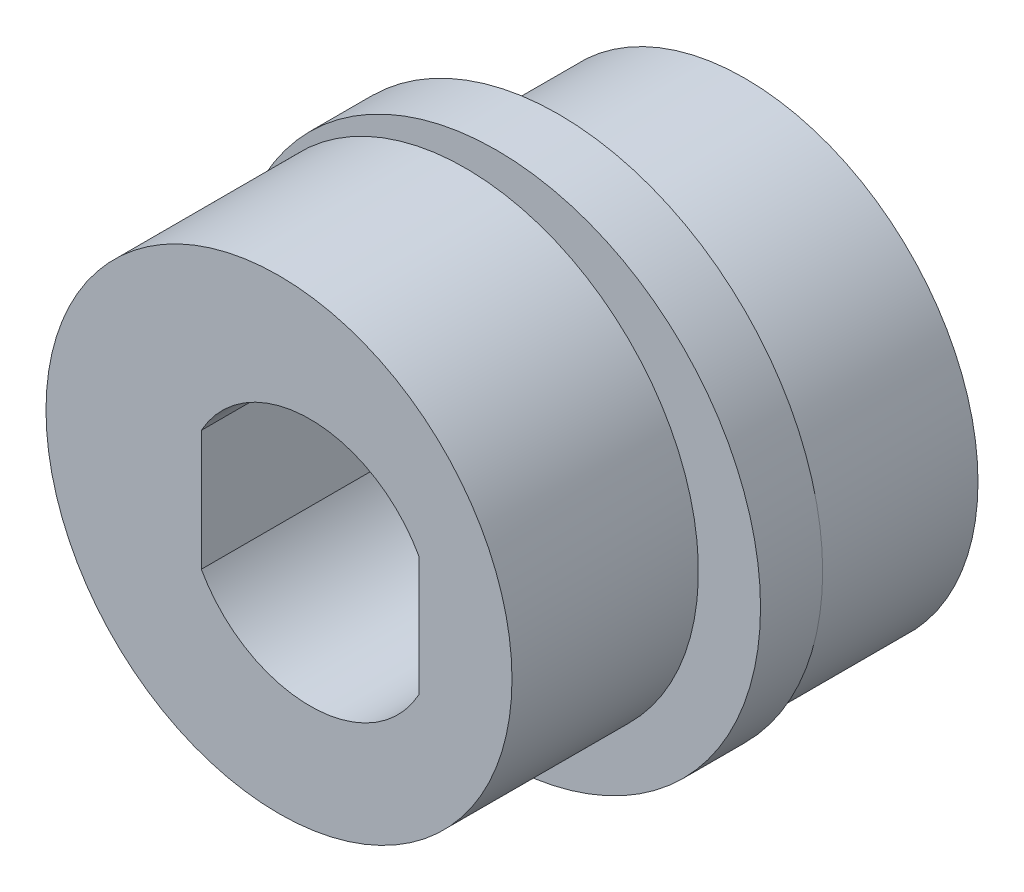
ISO-10303-21;
HEADER;
FILE_DESCRIPTION(('STEP AP214'),'2;1');
FILE_NAME('part.step','',(''),(''),'','','');
FILE_SCHEMA(('AUTOMOTIVE_DESIGN { 1 0 10303 214 1 1 1 1 }'));
ENDSEC;
DATA;
#1=APPLICATION_CONTEXT('core data for automotive mechanical design processes');
#2=APPLICATION_PROTOCOL_DEFINITION('international standard','automotive_design',2000,#1);
#3=PRODUCT_CONTEXT('',#1,'mechanical');
#4=PRODUCT('Part','Part','',(#3));
#5=PRODUCT_RELATED_PRODUCT_CATEGORY('part','',(#4));
#6=PRODUCT_DEFINITION_FORMATION('','',#4);
#7=PRODUCT_DEFINITION_CONTEXT('part definition',#1,'design');
#8=PRODUCT_DEFINITION('design','',#6,#7);
#9=PRODUCT_DEFINITION_SHAPE('','',#8);
#10=(LENGTH_UNIT() NAMED_UNIT(*) SI_UNIT(.MILLI.,.METRE.));
#11=(NAMED_UNIT(*) PLANE_ANGLE_UNIT() SI_UNIT($,.RADIAN.));
#12=(NAMED_UNIT(*) SI_UNIT($,.STERADIAN.) SOLID_ANGLE_UNIT());
#13=UNCERTAINTY_MEASURE_WITH_UNIT(LENGTH_MEASURE(1.E-05),#10,'distance_accuracy_value','');
#14=(GEOMETRIC_REPRESENTATION_CONTEXT(3) GLOBAL_UNCERTAINTY_ASSIGNED_CONTEXT((#13)) GLOBAL_UNIT_ASSIGNED_CONTEXT((#10,
#11,#12)) REPRESENTATION_CONTEXT('',''));
#15=CARTESIAN_POINT('',(0.,0.,0.));
#16=DIRECTION('',(0.,0.,1.));
#17=DIRECTION('',(1.,0.,0.));
#18=AXIS2_PLACEMENT_3D('',#15,#16,#17);
#19=CARTESIAN_POINT('',(-1.,0.,6.));
#20=DIRECTION('',(0.,0.,1.));
#21=DIRECTION('',(1.,0.,0.));
#22=AXIS2_PLACEMENT_3D('',#19,#20,#21);
#23=PLANE('',#22);
#24=CARTESIAN_POINT('',(-1.,0.,6.));
#25=DIRECTION('',(0.,0.,1.));
#26=DIRECTION('',(1.,0.,0.));
#27=AXIS2_PLACEMENT_3D('',#24,#25,#26);
#28=CIRCLE('',#27,7.5);
#29=CARTESIAN_POINT('',(6.5,0.,6.));
#30=VERTEX_POINT('',#29);
#31=EDGE_CURVE('E45',#30,#30,#28,.T.);
#32=ORIENTED_EDGE('',*,*,#31,.T.);
#33=EDGE_LOOP('',(#32));
#34=FACE_BOUND('',#33,.T.);
#35=DIRECTION('',(0.,-1.,0.));
#36=VECTOR('',#35,1.);
#37=CARTESIAN_POINT('',(-3.5,-1.93649167310371,6.));
#38=LINE('',#37,#36);
#39=CARTESIAN_POINT('',(-3.5,1.93649167310371,6.));
#40=VERTEX_POINT('',#39);
#41=CARTESIAN_POINT('',(-3.5,-1.93649167310371,6.));
#42=VERTEX_POINT('',#41);
#43=EDGE_CURVE('E122',#40,#42,#38,.T.);
#44=ORIENTED_EDGE('',*,*,#43,.F.);
#45=CARTESIAN_POINT('',(0.,0.,6.));
#46=DIRECTION('',(0.,0.,1.));
#47=DIRECTION('',(1.,0.,0.));
#48=AXIS2_PLACEMENT_3D('',#45,#46,#47);
#49=CIRCLE('',#48,4.);
#50=CARTESIAN_POINT('',(3.5,1.93649167310371,6.));
#51=VERTEX_POINT('',#50);
#52=EDGE_CURVE('E120',#51,#40,#49,.T.);
#53=ORIENTED_EDGE('',*,*,#52,.F.);
#54=DIRECTION('',(0.,1.,0.));
#55=VECTOR('',#54,1.);
#56=CARTESIAN_POINT('',(3.5,-1.93649167310371,6.));
#57=LINE('',#56,#55);
#58=CARTESIAN_POINT('',(3.5,-1.93649167310371,6.));
#59=VERTEX_POINT('',#58);
#60=EDGE_CURVE('E125',#59,#51,#57,.T.);
#61=ORIENTED_EDGE('',*,*,#60,.F.);
#62=CARTESIAN_POINT('',(0.,0.,6.));
#63=DIRECTION('',(0.,0.,1.));
#64=DIRECTION('',(1.,0.,0.));
#65=AXIS2_PLACEMENT_3D('',#62,#63,#64);
#66=CIRCLE('',#65,4.);
#67=EDGE_CURVE('E91',#42,#59,#66,.T.);
#68=ORIENTED_EDGE('',*,*,#67,.F.);
#69=EDGE_LOOP('',(#44,#53,#61,#68));
#70=FACE_BOUND('',#69,.T.);
#71=ADVANCED_FACE('F37',(#34,#70),#23,.T.);
#72=CARTESIAN_POINT('',(-1.,0.,6.));
#73=DIRECTION('',(0.,0.,-1.));
#74=DIRECTION('',(-1.,0.,0.));
#75=AXIS2_PLACEMENT_3D('',#72,#73,#74);
#76=CYLINDRICAL_SURFACE('',#75,7.5);
#77=ORIENTED_EDGE('',*,*,#31,.F.);
#78=EDGE_LOOP('',(#77));
#79=FACE_BOUND('',#78,.T.);
#80=CARTESIAN_POINT('',(-1.,0.,0.));
#81=DIRECTION('',(0.,0.,1.));
#82=DIRECTION('',(1.,0.,0.));
#83=AXIS2_PLACEMENT_3D('',#80,#81,#82);
#84=CIRCLE('',#83,7.5);
#85=CARTESIAN_POINT('',(-8.5,0.,0.));
#86=VERTEX_POINT('',#85);
#87=EDGE_CURVE('E51',#86,#86,#84,.T.);
#88=ORIENTED_EDGE('',*,*,#87,.T.);
#89=EDGE_LOOP('',(#88));
#90=FACE_BOUND('',#89,.T.);
#91=ADVANCED_FACE('F39',(#79,#90),#76,.T.);
#92=CARTESIAN_POINT('',(0.,0.,6.));
#93=DIRECTION('',(0.,0.,-1.));
#94=DIRECTION('',(-1.,0.,0.));
#95=AXIS2_PLACEMENT_3D('',#92,#93,#94);
#96=CYLINDRICAL_SURFACE('',#95,4.);
#97=CARTESIAN_POINT('',(0.,0.,-7.));
#98=DIRECTION('',(0.,0.,1.));
#99=DIRECTION('',(1.,0.,0.));
#100=AXIS2_PLACEMENT_3D('',#97,#98,#99);
#101=CIRCLE('',#100,4.);
#102=CARTESIAN_POINT('',(3.5,1.93649167310371,-7.));
#103=VERTEX_POINT('',#102);
#104=CARTESIAN_POINT('',(-3.5,1.93649167310371,-7.));
#105=VERTEX_POINT('',#104);
#106=EDGE_CURVE('E104',#103,#105,#101,.T.);
#107=ORIENTED_EDGE('',*,*,#106,.F.);
#108=DIRECTION('',(0.,0.,-1.));
#109=VECTOR('',#108,1.);
#110=CARTESIAN_POINT('',(3.5,1.93649167310371,6.));
#111=LINE('',#110,#109);
#112=EDGE_CURVE('E95',#51,#103,#111,.T.);
#113=ORIENTED_EDGE('',*,*,#112,.F.);
#114=ORIENTED_EDGE('',*,*,#52,.T.);
#115=DIRECTION('',(0.,0.,-1.));
#116=VECTOR('',#115,1.);
#117=CARTESIAN_POINT('',(-3.5,1.93649167310371,6.));
#118=LINE('',#117,#116);
#119=EDGE_CURVE('E129',#40,#105,#118,.T.);
#120=ORIENTED_EDGE('',*,*,#119,.T.);
#121=EDGE_LOOP('',(#107,#113,#114,#120));
#122=FACE_BOUND('',#121,.T.);
#123=ADVANCED_FACE('F152',(#122),#96,.F.);
#124=CARTESIAN_POINT('',(-3.5,-1.93649167310371,6.));
#125=DIRECTION('',(1.,0.,0.));
#126=DIRECTION('',(0.,0.,-1.));
#127=AXIS2_PLACEMENT_3D('',#124,#125,#126);
#128=PLANE('',#127);
#129=DIRECTION('',(0.,-1.,0.));
#130=VECTOR('',#129,1.);
#131=CARTESIAN_POINT('',(-3.5,1.93649167310371,-7.));
#132=LINE('',#131,#130);
#133=CARTESIAN_POINT('',(-3.5,-1.93649167310371,-7.));
#134=VERTEX_POINT('',#133);
#135=EDGE_CURVE('E109',#105,#134,#132,.T.);
#136=ORIENTED_EDGE('',*,*,#135,.F.);
#137=ORIENTED_EDGE('',*,*,#119,.F.);
#138=ORIENTED_EDGE('',*,*,#43,.T.);
#139=DIRECTION('',(0.,0.,-1.));
#140=VECTOR('',#139,1.);
#141=CARTESIAN_POINT('',(-3.5,-1.93649167310371,6.));
#142=LINE('',#141,#140);
#143=EDGE_CURVE('E94',#42,#134,#142,.T.);
#144=ORIENTED_EDGE('',*,*,#143,.T.);
#145=EDGE_LOOP('',(#136,#137,#138,#144));
#146=FACE_BOUND('',#145,.T.);
#147=ADVANCED_FACE('F158',(#146),#128,.T.);
#148=CARTESIAN_POINT('',(0.,0.,6.));
#149=DIRECTION('',(0.,0.,-1.));
#150=DIRECTION('',(-1.,0.,0.));
#151=AXIS2_PLACEMENT_3D('',#148,#149,#150);
#152=CYLINDRICAL_SURFACE('',#151,4.);
#153=CARTESIAN_POINT('',(0.,0.,-7.));
#154=DIRECTION('',(0.,0.,1.));
#155=DIRECTION('',(1.,0.,0.));
#156=AXIS2_PLACEMENT_3D('',#153,#154,#155);
#157=CIRCLE('',#156,4.);
#158=CARTESIAN_POINT('',(3.5,-1.93649167310371,-7.));
#159=VERTEX_POINT('',#158);
#160=EDGE_CURVE('E88',#134,#159,#157,.T.);
#161=ORIENTED_EDGE('',*,*,#160,.F.);
#162=ORIENTED_EDGE('',*,*,#143,.F.);
#163=ORIENTED_EDGE('',*,*,#67,.T.);
#164=DIRECTION('',(0.,0.,-1.));
#165=VECTOR('',#164,1.);
#166=CARTESIAN_POINT('',(3.5,-1.93649167310371,6.));
#167=LINE('',#166,#165);
#168=EDGE_CURVE('E83',#59,#159,#167,.T.);
#169=ORIENTED_EDGE('',*,*,#168,.T.);
#170=EDGE_LOOP('',(#161,#162,#163,#169));
#171=FACE_BOUND('',#170,.T.);
#172=ADVANCED_FACE('F85',(#171),#152,.F.);
#173=CARTESIAN_POINT('',(3.5,-1.93649167310371,6.));
#174=DIRECTION('',(-1.,0.,0.));
#175=DIRECTION('',(0.,0.,1.));
#176=AXIS2_PLACEMENT_3D('',#173,#174,#175);
#177=PLANE('',#176);
#178=DIRECTION('',(0.,1.,0.));
#179=VECTOR('',#178,1.);
#180=CARTESIAN_POINT('',(3.5,-1.93649167310371,-7.));
#181=LINE('',#180,#179);
#182=EDGE_CURVE('E98',#159,#103,#181,.T.);
#183=ORIENTED_EDGE('',*,*,#182,.F.);
#184=ORIENTED_EDGE('',*,*,#168,.F.);
#185=ORIENTED_EDGE('',*,*,#60,.T.);
#186=ORIENTED_EDGE('',*,*,#112,.T.);
#187=EDGE_LOOP('',(#183,#184,#185,#186));
#188=FACE_BOUND('',#187,.T.);
#189=ADVANCED_FACE('F99',(#188),#177,.T.);
#190=CARTESIAN_POINT('',(1.,0.,0.));
#191=DIRECTION('',(0.,0.,-1.));
#192=DIRECTION('',(-1.,0.,0.));
#193=AXIS2_PLACEMENT_3D('',#190,#191,#192);
#194=PLANE('',#193);
#195=ORIENTED_EDGE('',*,*,#87,.F.);
#196=CARTESIAN_POINT('',(0.,0.,0.));
#197=DIRECTION('',(0.,0.,-1.));
#198=DIRECTION('',(-1.,0.,0.));
#199=AXIS2_PLACEMENT_3D('',#196,#197,#198);
#200=CIRCLE('',#199,8.5);
#201=EDGE_CURVE('E111',#86,#86,#200,.T.);
#202=ORIENTED_EDGE('',*,*,#201,.F.);
#203=EDGE_LOOP('',(#195,#202));
#204=FACE_BOUND('',#203,.T.);
#205=ADVANCED_FACE('F136',(#204),#194,.F.);
#206=CARTESIAN_POINT('',(1.,0.,-7.));
#207=DIRECTION('',(0.,0.,-1.));
#208=DIRECTION('',(-1.,0.,0.));
#209=AXIS2_PLACEMENT_3D('',#206,#207,#208);
#210=PLANE('',#209);
#211=ORIENTED_EDGE('',*,*,#160,.T.);
#212=ORIENTED_EDGE('',*,*,#182,.T.);
#213=ORIENTED_EDGE('',*,*,#106,.T.);
#214=ORIENTED_EDGE('',*,*,#135,.T.);
#215=EDGE_LOOP('',(#211,#212,#213,#214));
#216=FACE_BOUND('',#215,.T.);
#217=CARTESIAN_POINT('',(1.,0.,-7.));
#218=DIRECTION('',(0.,0.,-1.));
#219=DIRECTION('',(-1.,0.,0.));
#220=AXIS2_PLACEMENT_3D('',#217,#218,#219);
#221=CIRCLE('',#220,7.5);
#222=CARTESIAN_POINT('',(-6.5,0.,-7.));
#223=VERTEX_POINT('',#222);
#224=EDGE_CURVE('E117',#223,#223,#221,.T.);
#225=ORIENTED_EDGE('',*,*,#224,.T.);
#226=EDGE_LOOP('',(#225));
#227=FACE_BOUND('',#226,.T.);
#228=ADVANCED_FACE('F106',(#216,#227),#210,.T.);
#229=CARTESIAN_POINT('',(1.,0.,-7.));
#230=DIRECTION('',(0.,0.,1.));
#231=DIRECTION('',(1.,0.,0.));
#232=AXIS2_PLACEMENT_3D('',#229,#230,#231);
#233=CYLINDRICAL_SURFACE('',#232,7.5);
#234=CARTESIAN_POINT('',(1.,0.,-2.));
#235=DIRECTION('',(0.,0.,-1.));
#236=DIRECTION('',(-1.,0.,0.));
#237=AXIS2_PLACEMENT_3D('',#234,#235,#236);
#238=CIRCLE('',#237,7.5);
#239=CARTESIAN_POINT('',(8.5,0.,-2.));
#240=VERTEX_POINT('',#239);
#241=EDGE_CURVE('E11',#240,#240,#238,.T.);
#242=ORIENTED_EDGE('',*,*,#241,.T.);
#243=EDGE_LOOP('',(#242));
#244=FACE_BOUND('',#243,.T.);
#245=ORIENTED_EDGE('',*,*,#224,.F.);
#246=EDGE_LOOP('',(#245));
#247=FACE_BOUND('',#246,.T.);
#248=ADVANCED_FACE('F143',(#244,#247),#233,.T.);
#249=CARTESIAN_POINT('',(0.,0.,-2.));
#250=DIRECTION('',(0.,0.,-1.));
#251=DIRECTION('',(-1.,0.,0.));
#252=AXIS2_PLACEMENT_3D('',#249,#250,#251);
#253=PLANE('',#252);
#254=CARTESIAN_POINT('',(0.,0.,-2.));
#255=DIRECTION('',(0.,0.,-1.));
#256=DIRECTION('',(-1.,0.,0.));
#257=AXIS2_PLACEMENT_3D('',#254,#255,#256);
#258=CIRCLE('',#257,8.5);
#259=EDGE_CURVE('E56',#240,#240,#258,.T.);
#260=ORIENTED_EDGE('',*,*,#259,.T.);
#261=ORIENTED_EDGE('',*,*,#241,.F.);
#262=EDGE_LOOP('',(#260,#261));
#263=FACE_BOUND('',#262,.T.);
#264=ADVANCED_FACE('F165',(#263),#253,.T.);
#265=CARTESIAN_POINT('',(0.,0.,-2.));
#266=DIRECTION('',(0.,0.,1.));
#267=DIRECTION('',(1.,0.,0.));
#268=AXIS2_PLACEMENT_3D('',#265,#266,#267);
#269=CYLINDRICAL_SURFACE('',#268,8.5);
#270=ORIENTED_EDGE('',*,*,#201,.T.);
#271=EDGE_LOOP('',(#270));
#272=FACE_BOUND('',#271,.T.);
#273=ORIENTED_EDGE('',*,*,#259,.F.);
#274=EDGE_LOOP('',(#273));
#275=FACE_BOUND('',#274,.T.);
#276=ADVANCED_FACE('F135',(#272,#275),#269,.T.);
#277=CLOSED_SHELL('',(#71,#91,#123,#147,#172,#189,#205,#228,#248,#264,#276));
#278=MANIFOLD_SOLID_BREP('B2',#277);
#279=ADVANCED_BREP_SHAPE_REPRESENTATION('',(#18,#278),#14);
#280=SHAPE_DEFINITION_REPRESENTATION(#9,#279);
ENDSEC;
END-ISO-10303-21;
